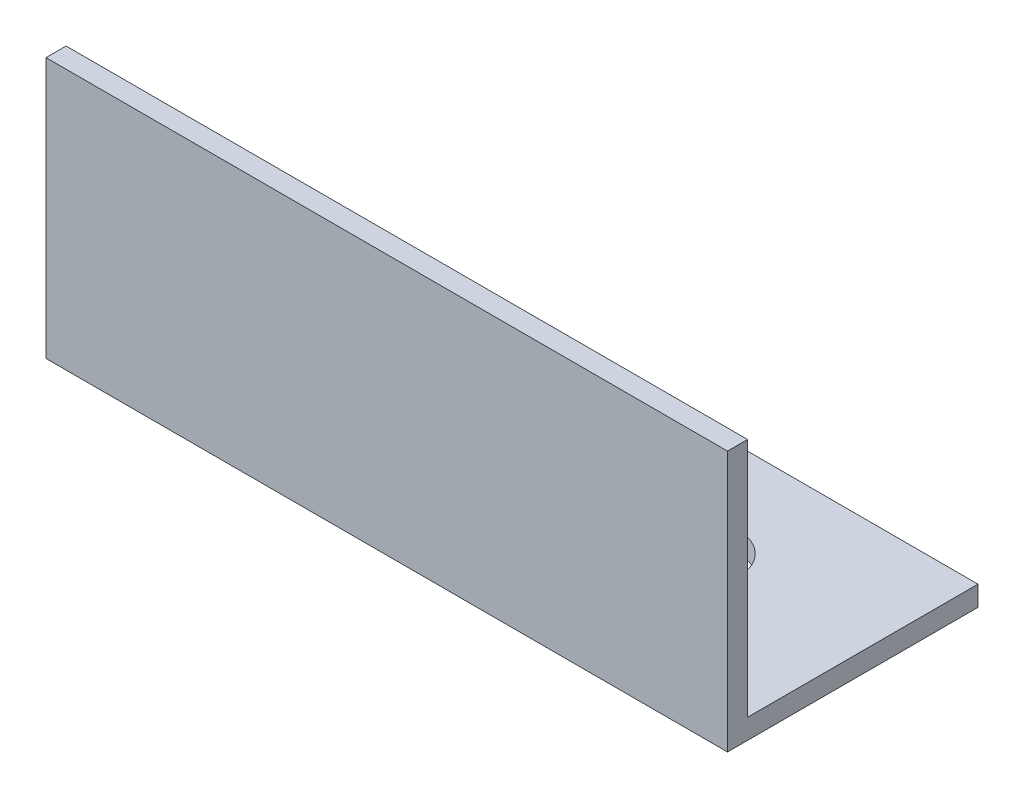
ISO-10303-21;
HEADER;
FILE_DESCRIPTION(('STEP AP214'),'2;1');
FILE_NAME('part.step','',(''),(''),'','','');
FILE_SCHEMA(('AUTOMOTIVE_DESIGN { 1 0 10303 214 1 1 1 1 }'));
ENDSEC;
DATA;
#1=APPLICATION_CONTEXT('core data for automotive mechanical design processes');
#2=APPLICATION_PROTOCOL_DEFINITION('international standard','automotive_design',2000,#1);
#3=PRODUCT_CONTEXT('',#1,'mechanical');
#4=PRODUCT('Part','Part','',(#3));
#5=PRODUCT_RELATED_PRODUCT_CATEGORY('part','',(#4));
#6=PRODUCT_DEFINITION_FORMATION('','',#4);
#7=PRODUCT_DEFINITION_CONTEXT('part definition',#1,'design');
#8=PRODUCT_DEFINITION('design','',#6,#7);
#9=PRODUCT_DEFINITION_SHAPE('','',#8);
#10=(LENGTH_UNIT() NAMED_UNIT(*) SI_UNIT(.MILLI.,.METRE.));
#11=(NAMED_UNIT(*) PLANE_ANGLE_UNIT() SI_UNIT($,.RADIAN.));
#12=(NAMED_UNIT(*) SI_UNIT($,.STERADIAN.) SOLID_ANGLE_UNIT());
#13=UNCERTAINTY_MEASURE_WITH_UNIT(LENGTH_MEASURE(1.E-05),#10,'distance_accuracy_value','');
#14=(GEOMETRIC_REPRESENTATION_CONTEXT(3) GLOBAL_UNCERTAINTY_ASSIGNED_CONTEXT((#13)) GLOBAL_UNIT_ASSIGNED_CONTEXT((#10,
#11,#12)) REPRESENTATION_CONTEXT('',''));
#15=CARTESIAN_POINT('',(0.,0.,0.));
#16=DIRECTION('',(0.,0.,1.));
#17=DIRECTION('',(1.,0.,0.));
#18=AXIS2_PLACEMENT_3D('',#15,#16,#17);
#19=CARTESIAN_POINT('',(-26.99,20.64,0.));
#20=DIRECTION('',(-1.,0.,0.));
#21=DIRECTION('',(0.,0.,1.));
#22=AXIS2_PLACEMENT_3D('',#19,#20,#21);
#23=PLANE('',#22);
#24=DIRECTION('',(0.,0.,-1.));
#25=VECTOR('',#24,1.);
#26=CARTESIAN_POINT('',(-26.99,0.,0.));
#27=LINE('',#26,#25);
#28=CARTESIAN_POINT('',(-26.99,0.,0.789999999999999));
#29=VERTEX_POINT('',#28);
#30=CARTESIAN_POINT('',(-26.99,0.,-19.05));
#31=VERTEX_POINT('',#30);
#32=EDGE_CURVE('E123',#29,#31,#27,.T.);
#33=ORIENTED_EDGE('',*,*,#32,.F.);
#34=DIRECTION('',(0.,-1.,0.));
#35=VECTOR('',#34,1.);
#36=CARTESIAN_POINT('',(-26.99,20.64,0.789999999999999));
#37=LINE('',#36,#35);
#38=CARTESIAN_POINT('',(-26.99,20.64,0.789999999999999));
#39=VERTEX_POINT('',#38);
#40=EDGE_CURVE('E11',#39,#29,#37,.T.);
#41=ORIENTED_EDGE('',*,*,#40,.F.);
#42=DIRECTION('',(0.,0.,-1.));
#43=VECTOR('',#42,1.);
#44=CARTESIAN_POINT('',(-26.99,20.64,0.));
#45=LINE('',#44,#43);
#46=CARTESIAN_POINT('',(-26.99,20.64,-0.800000000000001));
#47=VERTEX_POINT('',#46);
#48=EDGE_CURVE('E122',#39,#47,#45,.T.);
#49=ORIENTED_EDGE('',*,*,#48,.T.);
#50=DIRECTION('',(0.,-1.,0.));
#51=VECTOR('',#50,1.);
#52=CARTESIAN_POINT('',(-26.99,20.64,-0.800000000000001));
#53=LINE('',#52,#51);
#54=CARTESIAN_POINT('',(-26.99,1.59,-0.800000000000001));
#55=VERTEX_POINT('',#54);
#56=EDGE_CURVE('E64',#47,#55,#53,.T.);
#57=ORIENTED_EDGE('',*,*,#56,.T.);
#58=DIRECTION('',(0.,0.,-1.));
#59=VECTOR('',#58,1.);
#60=CARTESIAN_POINT('',(-26.99,1.59,0.));
#61=LINE('',#60,#59);
#62=CARTESIAN_POINT('',(-26.99,1.59,-19.05));
#63=VERTEX_POINT('',#62);
#64=EDGE_CURVE('E150',#55,#63,#61,.T.);
#65=ORIENTED_EDGE('',*,*,#64,.T.);
#66=DIRECTION('',(0.,-1.,0.));
#67=VECTOR('',#66,1.);
#68=CARTESIAN_POINT('',(-26.99,1.59,-19.05));
#69=LINE('',#68,#67);
#70=EDGE_CURVE('E160',#63,#31,#69,.T.);
#71=ORIENTED_EDGE('',*,*,#70,.T.);
#72=EDGE_LOOP('',(#33,#41,#49,#57,#65,#71));
#73=FACE_BOUND('',#72,.T.);
#74=ADVANCED_FACE('F45',(#73),#23,.T.);
#75=CARTESIAN_POINT('',(0.,20.64,0.789999999999999));
#76=DIRECTION('',(0.,0.,-1.));
#77=DIRECTION('',(-1.,0.,0.));
#78=AXIS2_PLACEMENT_3D('',#75,#76,#77);
#79=PLANE('',#78);
#80=ORIENTED_EDGE('',*,*,#40,.T.);
#81=DIRECTION('',(-1.,0.,0.));
#82=VECTOR('',#81,1.);
#83=CARTESIAN_POINT('',(-26.99,0.,0.789999999999999));
#84=LINE('',#83,#82);
#85=CARTESIAN_POINT('',(26.99,0.,0.789999999999999));
#86=VERTEX_POINT('',#85);
#87=EDGE_CURVE('E109',#86,#29,#84,.T.);
#88=ORIENTED_EDGE('',*,*,#87,.F.);
#89=DIRECTION('',(0.,-1.,0.));
#90=VECTOR('',#89,1.);
#91=CARTESIAN_POINT('',(26.99,20.64,0.789999999999999));
#92=LINE('',#91,#90);
#93=CARTESIAN_POINT('',(26.99,20.64,0.789999999999999));
#94=VERTEX_POINT('',#93);
#95=EDGE_CURVE('E53',#94,#86,#92,.T.);
#96=ORIENTED_EDGE('',*,*,#95,.F.);
#97=DIRECTION('',(1.,0.,0.));
#98=VECTOR('',#97,1.);
#99=CARTESIAN_POINT('',(0.,20.64,0.789999999999999));
#100=LINE('',#99,#98);
#101=EDGE_CURVE('E127',#39,#94,#100,.T.);
#102=ORIENTED_EDGE('',*,*,#101,.F.);
#103=EDGE_LOOP('',(#80,#88,#96,#102));
#104=FACE_BOUND('',#103,.T.);
#105=ADVANCED_FACE('F110',(#104),#79,.F.);
#106=CARTESIAN_POINT('',(26.99,20.64,0.));
#107=DIRECTION('',(-1.,0.,0.));
#108=DIRECTION('',(0.,0.,1.));
#109=AXIS2_PLACEMENT_3D('',#106,#107,#108);
#110=PLANE('',#109);
#111=ORIENTED_EDGE('',*,*,#95,.T.);
#112=DIRECTION('',(0.,0.,-1.));
#113=VECTOR('',#112,1.);
#114=CARTESIAN_POINT('',(26.99,0.,0.));
#115=LINE('',#114,#113);
#116=CARTESIAN_POINT('',(26.99,0.,-19.05));
#117=VERTEX_POINT('',#116);
#118=EDGE_CURVE('E100',#86,#117,#115,.T.);
#119=ORIENTED_EDGE('',*,*,#118,.T.);
#120=DIRECTION('',(0.,-1.,0.));
#121=VECTOR('',#120,1.);
#122=CARTESIAN_POINT('',(26.99,1.59,-19.05));
#123=LINE('',#122,#121);
#124=CARTESIAN_POINT('',(26.99,1.59,-19.05));
#125=VERTEX_POINT('',#124);
#126=EDGE_CURVE('E129',#125,#117,#123,.T.);
#127=ORIENTED_EDGE('',*,*,#126,.F.);
#128=DIRECTION('',(0.,0.,-1.));
#129=VECTOR('',#128,1.);
#130=CARTESIAN_POINT('',(26.99,1.59,0.));
#131=LINE('',#130,#129);
#132=CARTESIAN_POINT('',(26.99,1.59,-0.800000000000001));
#133=VERTEX_POINT('',#132);
#134=EDGE_CURVE('E140',#133,#125,#131,.T.);
#135=ORIENTED_EDGE('',*,*,#134,.F.);
#136=DIRECTION('',(0.,-1.,0.));
#137=VECTOR('',#136,1.);
#138=CARTESIAN_POINT('',(26.99,20.64,-0.800000000000001));
#139=LINE('',#138,#137);
#140=CARTESIAN_POINT('',(26.99,20.64,-0.800000000000001));
#141=VERTEX_POINT('',#140);
#142=EDGE_CURVE('E107',#141,#133,#139,.T.);
#143=ORIENTED_EDGE('',*,*,#142,.F.);
#144=DIRECTION('',(0.,0.,-1.));
#145=VECTOR('',#144,1.);
#146=CARTESIAN_POINT('',(26.99,20.64,0.));
#147=LINE('',#146,#145);
#148=EDGE_CURVE('E103',#94,#141,#147,.T.);
#149=ORIENTED_EDGE('',*,*,#148,.F.);
#150=EDGE_LOOP('',(#111,#119,#127,#135,#143,#149));
#151=FACE_BOUND('',#150,.T.);
#152=ADVANCED_FACE('F97',(#151),#110,.F.);
#153=CARTESIAN_POINT('',(0.,20.64,-0.800000000000001));
#154=DIRECTION('',(0.,0.,-1.));
#155=DIRECTION('',(-1.,0.,0.));
#156=AXIS2_PLACEMENT_3D('',#153,#154,#155);
#157=PLANE('',#156);
#158=DIRECTION('',(1.,0.,0.));
#159=VECTOR('',#158,1.);
#160=CARTESIAN_POINT('',(0.,1.59,-0.800000000000001));
#161=LINE('',#160,#159);
#162=EDGE_CURVE('E60',#55,#133,#161,.T.);
#163=ORIENTED_EDGE('',*,*,#162,.F.);
#164=ORIENTED_EDGE('',*,*,#56,.F.);
#165=DIRECTION('',(1.,0.,0.));
#166=VECTOR('',#165,1.);
#167=CARTESIAN_POINT('',(0.,20.64,-0.800000000000001));
#168=LINE('',#167,#166);
#169=EDGE_CURVE('E135',#47,#141,#168,.T.);
#170=ORIENTED_EDGE('',*,*,#169,.T.);
#171=ORIENTED_EDGE('',*,*,#142,.T.);
#172=EDGE_LOOP('',(#163,#164,#170,#171));
#173=FACE_BOUND('',#172,.T.);
#174=ADVANCED_FACE('F138',(#173),#157,.T.);
#175=CARTESIAN_POINT('',(0.,20.64,0.));
#176=DIRECTION('',(0.,1.,0.));
#177=DIRECTION('',(0.,0.,1.));
#178=AXIS2_PLACEMENT_3D('',#175,#176,#177);
#179=PLANE('',#178);
#180=ORIENTED_EDGE('',*,*,#48,.F.);
#181=ORIENTED_EDGE('',*,*,#101,.T.);
#182=ORIENTED_EDGE('',*,*,#148,.T.);
#183=ORIENTED_EDGE('',*,*,#169,.F.);
#184=EDGE_LOOP('',(#180,#181,#182,#183));
#185=FACE_BOUND('',#184,.T.);
#186=ADVANCED_FACE('F182',(#185),#179,.T.);
#187=CARTESIAN_POINT('',(0.,0.,0.));
#188=DIRECTION('',(0.,1.,0.));
#189=DIRECTION('',(0.,0.,1.));
#190=AXIS2_PLACEMENT_3D('',#187,#188,#189);
#191=PLANE('',#190);
#192=ORIENTED_EDGE('',*,*,#118,.F.);
#193=ORIENTED_EDGE('',*,*,#87,.T.);
#194=ORIENTED_EDGE('',*,*,#32,.T.);
#195=DIRECTION('',(1.,0.,0.));
#196=VECTOR('',#195,1.);
#197=CARTESIAN_POINT('',(0.,0.,-19.05));
#198=LINE('',#197,#196);
#199=EDGE_CURVE('E120',#31,#117,#198,.T.);
#200=ORIENTED_EDGE('',*,*,#199,.T.);
#201=EDGE_LOOP('',(#192,#193,#194,#200));
#202=FACE_BOUND('',#201,.T.);
#203=CARTESIAN_POINT('',(13.825,0.,-10.08));
#204=DIRECTION('',(0.,1.,0.));
#205=DIRECTION('',(0.,0.,1.));
#206=AXIS2_PLACEMENT_3D('',#203,#204,#205);
#207=CIRCLE('',#206,3.175);
#208=CARTESIAN_POINT('',(13.825,0.,-13.255));
#209=VERTEX_POINT('',#208);
#210=EDGE_CURVE('E114',#209,#209,#207,.T.);
#211=ORIENTED_EDGE('',*,*,#210,.T.);
#212=EDGE_LOOP('',(#211));
#213=FACE_BOUND('',#212,.T.);
#214=CARTESIAN_POINT('',(-13.825,0.,-10.08));
#215=DIRECTION('',(0.,1.,0.));
#216=DIRECTION('',(0.,0.,1.));
#217=AXIS2_PLACEMENT_3D('',#214,#215,#216);
#218=CIRCLE('',#217,3.175);
#219=CARTESIAN_POINT('',(-13.825,0.,-13.255));
#220=VERTEX_POINT('',#219);
#221=EDGE_CURVE('E164',#220,#220,#218,.T.);
#222=ORIENTED_EDGE('',*,*,#221,.T.);
#223=EDGE_LOOP('',(#222));
#224=FACE_BOUND('',#223,.T.);
#225=ADVANCED_FACE('F117',(#202,#213,#224),#191,.F.);
#226=CARTESIAN_POINT('',(-13.825,1.59,-10.08));
#227=DIRECTION('',(0.,-1.,0.));
#228=DIRECTION('',(0.,0.,-1.));
#229=AXIS2_PLACEMENT_3D('',#226,#227,#228);
#230=CYLINDRICAL_SURFACE('',#229,3.175);
#231=CARTESIAN_POINT('',(-13.825,1.59,-10.08));
#232=DIRECTION('',(0.,1.,0.));
#233=DIRECTION('',(0.,0.,1.));
#234=AXIS2_PLACEMENT_3D('',#231,#232,#233);
#235=CIRCLE('',#234,3.175);
#236=CARTESIAN_POINT('',(-13.825,1.59,-13.255));
#237=VERTEX_POINT('',#236);
#238=EDGE_CURVE('E154',#237,#237,#235,.T.);
#239=CARTESIAN_POINT('',(-13.825,1.59,-13.255));
#240=CARTESIAN_POINT('',(-13.825,1.5734375,-13.255));
#241=CARTESIAN_POINT('',(-13.825,1.556875,-13.255));
#242=CARTESIAN_POINT('',(-13.825,1.52375,-13.255));
#243=CARTESIAN_POINT('',(-13.825,1.5071875,-13.255));
#244=CARTESIAN_POINT('',(-13.825,1.4740625,-13.255));
#245=CARTESIAN_POINT('',(-13.825,1.4575,-13.255));
#246=CARTESIAN_POINT('',(-13.825,1.424375,-13.255));
#247=CARTESIAN_POINT('',(-13.825,1.4078125,-13.255));
#248=CARTESIAN_POINT('',(-13.825,1.3746875,-13.255));
#249=CARTESIAN_POINT('',(-13.825,1.358125,-13.255));
#250=CARTESIAN_POINT('',(-13.825,1.325,-13.255));
#251=CARTESIAN_POINT('',(-13.825,1.3084375,-13.255));
#252=CARTESIAN_POINT('',(-13.825,1.2753125,-13.255));
#253=CARTESIAN_POINT('',(-13.825,1.25875,-13.255));
#254=CARTESIAN_POINT('',(-13.825,1.225625,-13.255));
#255=CARTESIAN_POINT('',(-13.825,1.2090625,-13.255));
#256=CARTESIAN_POINT('',(-13.825,1.1759375,-13.255));
#257=CARTESIAN_POINT('',(-13.825,1.159375,-13.255));
#258=CARTESIAN_POINT('',(-13.825,1.12625,-13.255));
#259=CARTESIAN_POINT('',(-13.825,1.1096875,-13.255));
#260=CARTESIAN_POINT('',(-13.825,1.0765625,-13.255));
#261=CARTESIAN_POINT('',(-13.825,1.06,-13.255));
#262=CARTESIAN_POINT('',(-13.825,1.026875,-13.255));
#263=CARTESIAN_POINT('',(-13.825,1.0103125,-13.255));
#264=CARTESIAN_POINT('',(-13.825,0.9771875,-13.255));
#265=CARTESIAN_POINT('',(-13.825,0.960625,-13.255));
#266=CARTESIAN_POINT('',(-13.825,0.9275,-13.255));
#267=CARTESIAN_POINT('',(-13.825,0.9109375,-13.255));
#268=CARTESIAN_POINT('',(-13.825,0.8778125,-13.255));
#269=CARTESIAN_POINT('',(-13.825,0.86125,-13.255));
#270=CARTESIAN_POINT('',(-13.825,0.828125,-13.255));
#271=CARTESIAN_POINT('',(-13.825,0.8115625,-13.255));
#272=CARTESIAN_POINT('',(-13.825,0.7784375,-13.255));
#273=CARTESIAN_POINT('',(-13.825,0.761875,-13.255));
#274=CARTESIAN_POINT('',(-13.825,0.72875,-13.255));
#275=CARTESIAN_POINT('',(-13.825,0.7121875,-13.255));
#276=CARTESIAN_POINT('',(-13.825,0.6790625,-13.255));
#277=CARTESIAN_POINT('',(-13.825,0.6625,-13.255));
#278=CARTESIAN_POINT('',(-13.825,0.629375,-13.255));
#279=CARTESIAN_POINT('',(-13.825,0.6128125,-13.255));
#280=CARTESIAN_POINT('',(-13.825,0.5796875,-13.255));
#281=CARTESIAN_POINT('',(-13.825,0.563125,-13.255));
#282=CARTESIAN_POINT('',(-13.825,0.53,-13.255));
#283=CARTESIAN_POINT('',(-13.825,0.5134375,-13.255));
#284=CARTESIAN_POINT('',(-13.825,0.4803125,-13.255));
#285=CARTESIAN_POINT('',(-13.825,0.46375,-13.255));
#286=CARTESIAN_POINT('',(-13.825,0.430625,-13.255));
#287=CARTESIAN_POINT('',(-13.825,0.4140625,-13.255));
#288=CARTESIAN_POINT('',(-13.825,0.3809375,-13.255));
#289=CARTESIAN_POINT('',(-13.825,0.364375,-13.255));
#290=CARTESIAN_POINT('',(-13.825,0.33125,-13.255));
#291=CARTESIAN_POINT('',(-13.825,0.3146875,-13.255));
#292=CARTESIAN_POINT('',(-13.825,0.2815625,-13.255));
#293=CARTESIAN_POINT('',(-13.825,0.265,-13.255));
#294=CARTESIAN_POINT('',(-13.825,0.231875,-13.255));
#295=CARTESIAN_POINT('',(-13.825,0.2153125,-13.255));
#296=CARTESIAN_POINT('',(-13.825,0.1821875,-13.255));
#297=CARTESIAN_POINT('',(-13.825,0.165625,-13.255));
#298=CARTESIAN_POINT('',(-13.825,0.1325,-13.255));
#299=CARTESIAN_POINT('',(-13.825,0.1159375,-13.255));
#300=CARTESIAN_POINT('',(-13.825,0.0828125000000001,-13.255));
#301=CARTESIAN_POINT('',(-13.825,0.06625,-13.255));
#302=CARTESIAN_POINT('',(-13.825,0.033125,-13.255));
#303=CARTESIAN_POINT('',(-13.825,0.0165625,-13.255));
#304=CARTESIAN_POINT('',(-13.825,0.,-13.255));
#305=B_SPLINE_CURVE_WITH_KNOTS('',3,(#239,#240,#241,#242,#243,#244,#245,#246,#247,#248,#249,
#250,#251,#252,#253,#254,#255,#256,#257,#258,#259,#260,#261,#262,#263,#264,#265,#266,#267,#268,
#269,#270,#271,#272,#273,#274,#275,#276,#277,#278,#279,#280,#281,#282,#283,#284,#285,#286,#287,
#288,#289,#290,#291,#292,#293,#294,#295,#296,#297,#298,#299,#300,#301,#302,#303,#304),
.UNSPECIFIED.,.F.,.F.,(4,2,2,2,2,2,2,2,2,2,2,2,2,2,2,2,2,2,2,2,2,2,2,2,2,2,2,2,2,2,2,2,4),(0.,
0.0496874999999998,0.0993749999999999,0.1490625,0.19875,0.2484375,0.298125,0.3478125,0.3975,
0.4471875,0.496875,0.5465625,0.59625,0.6459375,0.695625,0.7453125,0.795,0.8446875,0.894375,
0.9440625,0.99375,1.0434375,1.093125,1.1428125,1.1925,1.2421875,1.291875,1.3415625,1.39125,
1.4409375,1.490625,1.5403125,1.59),.UNSPECIFIED.);
#306=EDGE_CURVE('BSEAM195',#237,#220,#305,.T.);
#307=ORIENTED_EDGE('',*,*,#238,.T.);
#308=ORIENTED_EDGE('',*,*,#221,.F.);
#309=ORIENTED_EDGE('',*,*,#306,.T.);
#310=ORIENTED_EDGE('',*,*,#306,.F.);
#311=EDGE_LOOP('',(#307,#309,#308,#310));
#312=FACE_BOUND('',#311,.T.);
#313=ADVANCED_FACE('F195',(#312),#230,.F.);
#314=CARTESIAN_POINT('',(13.825,1.59,-10.08));
#315=DIRECTION('',(0.,-1.,0.));
#316=DIRECTION('',(0.,0.,-1.));
#317=AXIS2_PLACEMENT_3D('',#314,#315,#316);
#318=CYLINDRICAL_SURFACE('',#317,3.175);
#319=CARTESIAN_POINT('',(13.825,1.59,-10.08));
#320=DIRECTION('',(0.,1.,0.));
#321=DIRECTION('',(0.,0.,1.));
#322=AXIS2_PLACEMENT_3D('',#319,#320,#321);
#323=CIRCLE('',#322,3.175);
#324=CARTESIAN_POINT('',(13.825,1.59,-13.255));
#325=VERTEX_POINT('',#324);
#326=EDGE_CURVE('E170',#325,#325,#323,.T.);
#327=CARTESIAN_POINT('',(13.825,1.59,-13.255));
#328=CARTESIAN_POINT('',(13.825,1.5734375,-13.255));
#329=CARTESIAN_POINT('',(13.825,1.556875,-13.255));
#330=CARTESIAN_POINT('',(13.825,1.52375,-13.255));
#331=CARTESIAN_POINT('',(13.825,1.5071875,-13.255));
#332=CARTESIAN_POINT('',(13.825,1.4740625,-13.255));
#333=CARTESIAN_POINT('',(13.825,1.4575,-13.255));
#334=CARTESIAN_POINT('',(13.825,1.424375,-13.255));
#335=CARTESIAN_POINT('',(13.825,1.4078125,-13.255));
#336=CARTESIAN_POINT('',(13.825,1.3746875,-13.255));
#337=CARTESIAN_POINT('',(13.825,1.358125,-13.255));
#338=CARTESIAN_POINT('',(13.825,1.325,-13.255));
#339=CARTESIAN_POINT('',(13.825,1.3084375,-13.255));
#340=CARTESIAN_POINT('',(13.825,1.2753125,-13.255));
#341=CARTESIAN_POINT('',(13.825,1.25875,-13.255));
#342=CARTESIAN_POINT('',(13.825,1.225625,-13.255));
#343=CARTESIAN_POINT('',(13.825,1.2090625,-13.255));
#344=CARTESIAN_POINT('',(13.825,1.1759375,-13.255));
#345=CARTESIAN_POINT('',(13.825,1.159375,-13.255));
#346=CARTESIAN_POINT('',(13.825,1.12625,-13.255));
#347=CARTESIAN_POINT('',(13.825,1.1096875,-13.255));
#348=CARTESIAN_POINT('',(13.825,1.0765625,-13.255));
#349=CARTESIAN_POINT('',(13.825,1.06,-13.255));
#350=CARTESIAN_POINT('',(13.825,1.026875,-13.255));
#351=CARTESIAN_POINT('',(13.825,1.0103125,-13.255));
#352=CARTESIAN_POINT('',(13.825,0.9771875,-13.255));
#353=CARTESIAN_POINT('',(13.825,0.960625,-13.255));
#354=CARTESIAN_POINT('',(13.825,0.9275,-13.255));
#355=CARTESIAN_POINT('',(13.825,0.9109375,-13.255));
#356=CARTESIAN_POINT('',(13.825,0.8778125,-13.255));
#357=CARTESIAN_POINT('',(13.825,0.86125,-13.255));
#358=CARTESIAN_POINT('',(13.825,0.828125,-13.255));
#359=CARTESIAN_POINT('',(13.825,0.8115625,-13.255));
#360=CARTESIAN_POINT('',(13.825,0.7784375,-13.255));
#361=CARTESIAN_POINT('',(13.825,0.761875,-13.255));
#362=CARTESIAN_POINT('',(13.825,0.72875,-13.255));
#363=CARTESIAN_POINT('',(13.825,0.7121875,-13.255));
#364=CARTESIAN_POINT('',(13.825,0.6790625,-13.255));
#365=CARTESIAN_POINT('',(13.825,0.6625,-13.255));
#366=CARTESIAN_POINT('',(13.825,0.629375,-13.255));
#367=CARTESIAN_POINT('',(13.825,0.6128125,-13.255));
#368=CARTESIAN_POINT('',(13.825,0.5796875,-13.255));
#369=CARTESIAN_POINT('',(13.825,0.563125,-13.255));
#370=CARTESIAN_POINT('',(13.825,0.53,-13.255));
#371=CARTESIAN_POINT('',(13.825,0.5134375,-13.255));
#372=CARTESIAN_POINT('',(13.825,0.4803125,-13.255));
#373=CARTESIAN_POINT('',(13.825,0.46375,-13.255));
#374=CARTESIAN_POINT('',(13.825,0.430625,-13.255));
#375=CARTESIAN_POINT('',(13.825,0.4140625,-13.255));
#376=CARTESIAN_POINT('',(13.825,0.3809375,-13.255));
#377=CARTESIAN_POINT('',(13.825,0.364375,-13.255));
#378=CARTESIAN_POINT('',(13.825,0.33125,-13.255));
#379=CARTESIAN_POINT('',(13.825,0.3146875,-13.255));
#380=CARTESIAN_POINT('',(13.825,0.2815625,-13.255));
#381=CARTESIAN_POINT('',(13.825,0.265,-13.255));
#382=CARTESIAN_POINT('',(13.825,0.231875,-13.255));
#383=CARTESIAN_POINT('',(13.825,0.2153125,-13.255));
#384=CARTESIAN_POINT('',(13.825,0.1821875,-13.255));
#385=CARTESIAN_POINT('',(13.825,0.165625,-13.255));
#386=CARTESIAN_POINT('',(13.825,0.1325,-13.255));
#387=CARTESIAN_POINT('',(13.825,0.1159375,-13.255));
#388=CARTESIAN_POINT('',(13.825,0.0828125000000001,-13.255));
#389=CARTESIAN_POINT('',(13.825,0.06625,-13.255));
#390=CARTESIAN_POINT('',(13.825,0.033125,-13.255));
#391=CARTESIAN_POINT('',(13.825,0.0165625,-13.255));
#392=CARTESIAN_POINT('',(13.825,0.,-13.255));
#393=B_SPLINE_CURVE_WITH_KNOTS('',3,(#327,#328,#329,#330,#331,#332,#333,#334,#335,#336,#337,
#338,#339,#340,#341,#342,#343,#344,#345,#346,#347,#348,#349,#350,#351,#352,#353,#354,#355,#356,
#357,#358,#359,#360,#361,#362,#363,#364,#365,#366,#367,#368,#369,#370,#371,#372,#373,#374,#375,
#376,#377,#378,#379,#380,#381,#382,#383,#384,#385,#386,#387,#388,#389,#390,#391,#392),
.UNSPECIFIED.,.F.,.F.,(4,2,2,2,2,2,2,2,2,2,2,2,2,2,2,2,2,2,2,2,2,2,2,2,2,2,2,2,2,2,2,2,4),(0.,
0.0496874999999998,0.0993749999999999,0.1490625,0.19875,0.2484375,0.298125,0.3478125,0.3975,
0.4471875,0.496875,0.5465625,0.59625,0.6459375,0.695625,0.7453125,0.795,0.8446875,0.894375,
0.9440625,0.99375,1.0434375,1.093125,1.1428125,1.1925,1.2421875,1.291875,1.3415625,1.39125,
1.4409375,1.490625,1.5403125,1.59),.UNSPECIFIED.);
#394=EDGE_CURVE('BSEAM187',#325,#209,#393,.T.);
#395=ORIENTED_EDGE('',*,*,#326,.T.);
#396=ORIENTED_EDGE('',*,*,#210,.F.);
#397=ORIENTED_EDGE('',*,*,#394,.T.);
#398=ORIENTED_EDGE('',*,*,#394,.F.);
#399=EDGE_LOOP('',(#395,#397,#396,#398));
#400=FACE_BOUND('',#399,.T.);
#401=ADVANCED_FACE('F187',(#400),#318,.F.);
#402=CARTESIAN_POINT('',(0.,1.59,-19.05));
#403=DIRECTION('',(0.,0.,-1.));
#404=DIRECTION('',(-1.,0.,0.));
#405=AXIS2_PLACEMENT_3D('',#402,#403,#404);
#406=PLANE('',#405);
#407=ORIENTED_EDGE('',*,*,#199,.F.);
#408=ORIENTED_EDGE('',*,*,#70,.F.);
#409=DIRECTION('',(1.,0.,0.));
#410=VECTOR('',#409,1.);
#411=CARTESIAN_POINT('',(0.,1.59,-19.05));
#412=LINE('',#411,#410);
#413=EDGE_CURVE('E145',#63,#125,#412,.T.);
#414=ORIENTED_EDGE('',*,*,#413,.T.);
#415=ORIENTED_EDGE('',*,*,#126,.T.);
#416=EDGE_LOOP('',(#407,#408,#414,#415));
#417=FACE_BOUND('',#416,.T.);
#418=ADVANCED_FACE('F185',(#417),#406,.T.);
#419=CARTESIAN_POINT('',(0.,1.59,0.));
#420=DIRECTION('',(0.,1.,0.));
#421=DIRECTION('',(0.,0.,1.));
#422=AXIS2_PLACEMENT_3D('',#419,#420,#421);
#423=PLANE('',#422);
#424=ORIENTED_EDGE('',*,*,#326,.F.);
#425=EDGE_LOOP('',(#424));
#426=FACE_BOUND('',#425,.T.);
#427=ORIENTED_EDGE('',*,*,#238,.F.);
#428=EDGE_LOOP('',(#427));
#429=FACE_BOUND('',#428,.T.);
#430=ORIENTED_EDGE('',*,*,#64,.F.);
#431=ORIENTED_EDGE('',*,*,#162,.T.);
#432=ORIENTED_EDGE('',*,*,#134,.T.);
#433=ORIENTED_EDGE('',*,*,#413,.F.);
#434=EDGE_LOOP('',(#430,#431,#432,#433));
#435=FACE_BOUND('',#434,.T.);
#436=ADVANCED_FACE('F148',(#426,#429,#435),#423,.T.);
#437=CLOSED_SHELL('',(#74,#105,#152,#174,#186,#225,#313,#401,#418,#436));
#438=MANIFOLD_SOLID_BREP('B2',#437);
#439=ADVANCED_BREP_SHAPE_REPRESENTATION('',(#18,#438),#14);
#440=SHAPE_DEFINITION_REPRESENTATION(#9,#439);
ENDSEC;
END-ISO-10303-21;
